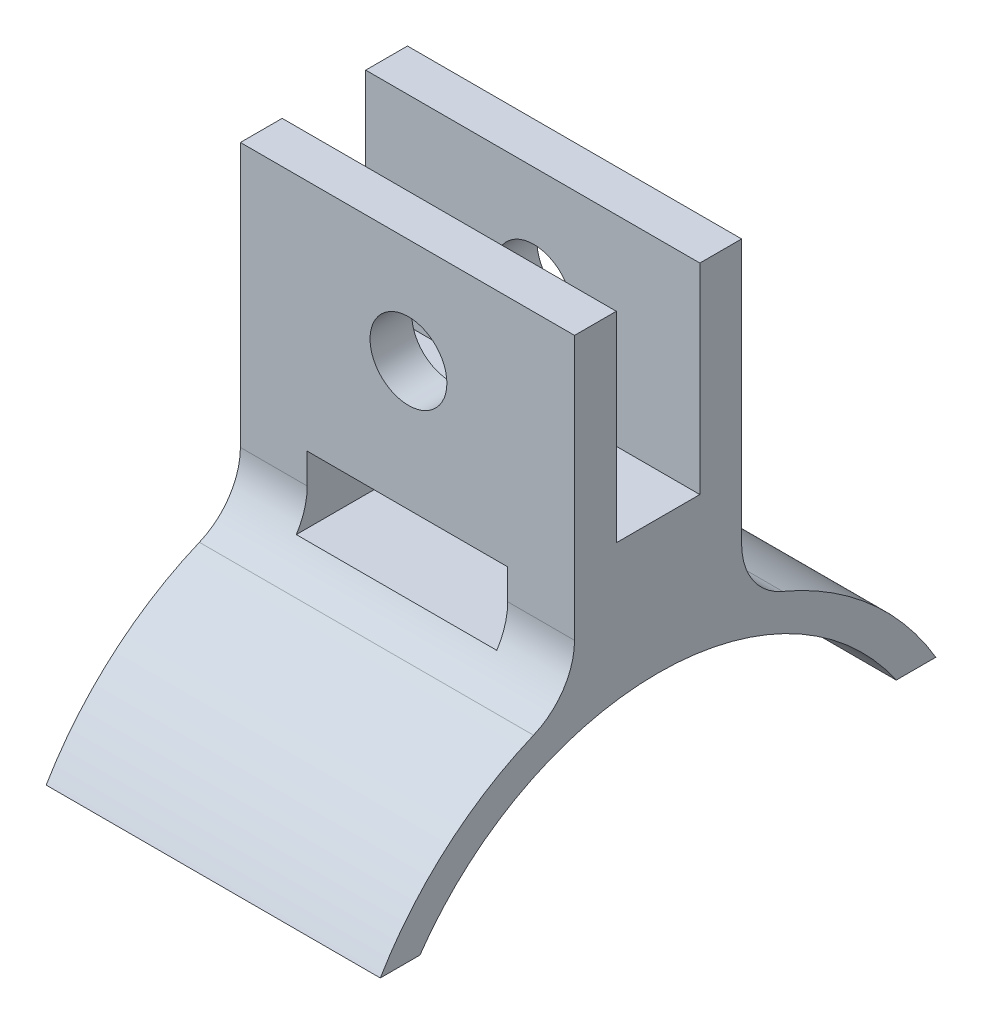
ISO-10303-21;
HEADER;
FILE_DESCRIPTION(('STEP AP214'),'2;1');
FILE_NAME('part.step','',(''),(''),'','','');
FILE_SCHEMA(('AUTOMOTIVE_DESIGN { 1 0 10303 214 1 1 1 1 }'));
ENDSEC;
DATA;
#1=APPLICATION_CONTEXT('core data for automotive mechanical design processes');
#2=APPLICATION_PROTOCOL_DEFINITION('international standard','automotive_design',2000,#1);
#3=PRODUCT_CONTEXT('',#1,'mechanical');
#4=PRODUCT('Part','Part','',(#3));
#5=PRODUCT_RELATED_PRODUCT_CATEGORY('part','',(#4));
#6=PRODUCT_DEFINITION_FORMATION('','',#4);
#7=PRODUCT_DEFINITION_CONTEXT('part definition',#1,'design');
#8=PRODUCT_DEFINITION('design','',#6,#7);
#9=PRODUCT_DEFINITION_SHAPE('','',#8);
#10=(LENGTH_UNIT() NAMED_UNIT(*) SI_UNIT(.MILLI.,.METRE.));
#11=(NAMED_UNIT(*) PLANE_ANGLE_UNIT() SI_UNIT($,.RADIAN.));
#12=(NAMED_UNIT(*) SI_UNIT($,.STERADIAN.) SOLID_ANGLE_UNIT());
#13=UNCERTAINTY_MEASURE_WITH_UNIT(LENGTH_MEASURE(1.E-05),#10,'distance_accuracy_value','');
#14=(GEOMETRIC_REPRESENTATION_CONTEXT(3) GLOBAL_UNCERTAINTY_ASSIGNED_CONTEXT((#13)) GLOBAL_UNIT_ASSIGNED_CONTEXT((#10,
#11,#12)) REPRESENTATION_CONTEXT('',''));
#15=CARTESIAN_POINT('',(0.,0.,0.));
#16=DIRECTION('',(0.,0.,1.));
#17=DIRECTION('',(1.,0.,0.));
#18=AXIS2_PLACEMENT_3D('',#15,#16,#17);
#19=CARTESIAN_POINT('',(0.,14.7955,13.517499908));
#20=DIRECTION('',(0.,-1.,0.));
#21=DIRECTION('',(0.,0.,-1.));
#22=AXIS2_PLACEMENT_3D('',#19,#20,#21);
#23=PLANE('',#22);
#24=DIRECTION('',(-1.,0.,0.));
#25=VECTOR('',#24,1.);
#26=CARTESIAN_POINT('',(6.35,14.7955,3.175));
#27=LINE('',#26,#25);
#28=CARTESIAN_POINT('',(20.9174333758312,14.7955,3.175));
#29=VERTEX_POINT('',#28);
#30=CARTESIAN_POINT('',(13.2974333758312,14.7955,3.175));
#31=VERTEX_POINT('',#30);
#32=EDGE_CURVE('E270',#29,#31,#27,.T.);
#33=ORIENTED_EDGE('',*,*,#32,.T.);
#34=DIRECTION('',(0.,0.,-1.));
#35=VECTOR('',#34,1.);
#36=CARTESIAN_POINT('',(13.2974333758312,14.7955,13.517499908));
#37=LINE('',#36,#35);
#38=CARTESIAN_POINT('',(13.2974333758312,14.7955,-3.175));
#39=VERTEX_POINT('',#38);
#40=EDGE_CURVE('E239',#31,#39,#37,.T.);
#41=ORIENTED_EDGE('',*,*,#40,.T.);
#42=DIRECTION('',(1.,0.,0.));
#43=VECTOR('',#42,1.);
#44=CARTESIAN_POINT('',(6.35,14.7955,-3.175));
#45=LINE('',#44,#43);
#46=CARTESIAN_POINT('',(20.9174333758312,14.7955,-3.175));
#47=VERTEX_POINT('',#46);
#48=EDGE_CURVE('E320',#39,#47,#45,.T.);
#49=ORIENTED_EDGE('',*,*,#48,.T.);
#50=DIRECTION('',(0.,0.,-1.));
#51=VECTOR('',#50,1.);
#52=CARTESIAN_POINT('',(20.9174333758312,14.7955,13.517499908));
#53=LINE('',#52,#51);
#54=EDGE_CURVE('E247',#29,#47,#53,.T.);
#55=ORIENTED_EDGE('',*,*,#54,.F.);
#56=EDGE_LOOP('',(#33,#41,#49,#55));
#57=FACE_BOUND('',#56,.T.);
#58=ADVANCED_FACE('F37',(#57),#23,.T.);
#59=CARTESIAN_POINT('',(13.2974333758312,0.,13.517499908));
#60=DIRECTION('',(1.,0.,0.));
#61=DIRECTION('',(0.,0.,-1.));
#62=AXIS2_PLACEMENT_3D('',#59,#60,#61);
#63=PLANE('',#62);
#64=DIRECTION('',(0.,1.,0.));
#65=VECTOR('',#64,1.);
#66=CARTESIAN_POINT('',(13.2974333758312,23.6855,-3.175));
#67=LINE('',#66,#65);
#68=CARTESIAN_POINT('',(13.2974333758312,13.6471826854483,-3.175));
#69=VERTEX_POINT('',#68);
#70=EDGE_CURVE('E268',#69,#39,#67,.T.);
#71=ORIENTED_EDGE('',*,*,#70,.T.);
#72=ORIENTED_EDGE('',*,*,#40,.F.);
#73=DIRECTION('',(0.,-1.,0.));
#74=VECTOR('',#73,1.);
#75=CARTESIAN_POINT('',(13.2974333758312,23.6855,3.175));
#76=LINE('',#75,#74);
#77=CARTESIAN_POINT('',(13.2974333758312,13.6471826854483,3.175));
#78=VERTEX_POINT('',#77);
#79=EDGE_CURVE('E263',#31,#78,#76,.T.);
#80=ORIENTED_EDGE('',*,*,#79,.T.);
#81=CARTESIAN_POINT('',(13.2974333758312,13.6471826854483,5.715));
#82=DIRECTION('',(1.,0.,0.));
#83=DIRECTION('',(0.,0.,-1.));
#84=AXIS2_PLACEMENT_3D('',#81,#82,#83);
#85=CIRCLE('',#84,2.54);
#86=CARTESIAN_POINT('',(13.2974333758312,12.2555,3.59018958421618));
#87=VERTEX_POINT('',#86);
#88=EDGE_CURVE('E318',#78,#87,#85,.F.);
#89=ORIENTED_EDGE('',*,*,#88,.T.);
#90=DIRECTION('',(0.,0.,-1.));
#91=VECTOR('',#90,1.);
#92=CARTESIAN_POINT('',(13.2974333758312,12.2555,13.517499908));
#93=LINE('',#92,#91);
#94=CARTESIAN_POINT('',(13.2974333758312,12.2555,-3.59018958421619));
#95=VERTEX_POINT('',#94);
#96=EDGE_CURVE('E240',#87,#95,#93,.T.);
#97=ORIENTED_EDGE('',*,*,#96,.T.);
#98=CARTESIAN_POINT('',(13.2974333758312,13.6471826854483,-5.71500000000001));
#99=DIRECTION('',(1.,0.,0.));
#100=DIRECTION('',(0.,0.,-1.));
#101=AXIS2_PLACEMENT_3D('',#98,#99,#100);
#102=CIRCLE('',#101,2.54);
#103=EDGE_CURVE('E266',#95,#69,#102,.F.);
#104=ORIENTED_EDGE('',*,*,#103,.T.);
#105=EDGE_LOOP('',(#71,#72,#80,#89,#97,#104));
#106=FACE_BOUND('',#105,.T.);
#107=ADVANCED_FACE('F397',(#106),#63,.T.);
#108=CARTESIAN_POINT('',(0.,12.2555,13.517499908));
#109=DIRECTION('',(0.,-1.,0.));
#110=DIRECTION('',(0.,0.,-1.));
#111=AXIS2_PLACEMENT_3D('',#108,#109,#110);
#112=PLANE('',#111);
#113=ORIENTED_EDGE('',*,*,#96,.F.);
#114=DIRECTION('',(-1.,0.,0.));
#115=VECTOR('',#114,1.);
#116=CARTESIAN_POINT('',(27.94,12.2555,3.59018958421618));
#117=LINE('',#116,#115);
#118=CARTESIAN_POINT('',(20.9174333758312,12.2555,3.59018958421618));
#119=VERTEX_POINT('',#118);
#120=EDGE_CURVE('E315',#119,#87,#117,.T.);
#121=ORIENTED_EDGE('',*,*,#120,.F.);
#122=DIRECTION('',(0.,0.,-1.));
#123=VECTOR('',#122,1.);
#124=CARTESIAN_POINT('',(20.9174333758312,12.2555,13.517499908));
#125=LINE('',#124,#123);
#126=CARTESIAN_POINT('',(20.9174333758312,12.2555,-3.59018958421619));
#127=VERTEX_POINT('',#126);
#128=EDGE_CURVE('E244',#119,#127,#125,.T.);
#129=ORIENTED_EDGE('',*,*,#128,.T.);
#130=DIRECTION('',(-1.,0.,0.));
#131=VECTOR('',#130,1.);
#132=CARTESIAN_POINT('',(27.94,12.2555,-3.59018958421619));
#133=LINE('',#132,#131);
#134=EDGE_CURVE('E260',#95,#127,#133,.F.);
#135=ORIENTED_EDGE('',*,*,#134,.F.);
#136=EDGE_LOOP('',(#113,#121,#129,#135));
#137=FACE_BOUND('',#136,.T.);
#138=ADVANCED_FACE('F403',(#137),#112,.F.);
#139=CARTESIAN_POINT('',(20.9174333758312,0.,13.517499908));
#140=DIRECTION('',(1.,0.,0.));
#141=DIRECTION('',(0.,0.,-1.));
#142=AXIS2_PLACEMENT_3D('',#139,#140,#141);
#143=PLANE('',#142);
#144=CARTESIAN_POINT('',(20.9174333758312,13.6471826854483,-5.71500000000001));
#145=DIRECTION('',(1.,0.,0.));
#146=DIRECTION('',(0.,0.,-1.));
#147=AXIS2_PLACEMENT_3D('',#144,#145,#146);
#148=CIRCLE('',#147,2.54);
#149=CARTESIAN_POINT('',(20.9174333758312,13.6471826854483,-3.175));
#150=VERTEX_POINT('',#149);
#151=EDGE_CURVE('E254',#127,#150,#148,.F.);
#152=ORIENTED_EDGE('',*,*,#151,.F.);
#153=ORIENTED_EDGE('',*,*,#128,.F.);
#154=CARTESIAN_POINT('',(20.9174333758312,13.6471826854483,5.715));
#155=DIRECTION('',(1.,0.,0.));
#156=DIRECTION('',(0.,0.,-1.));
#157=AXIS2_PLACEMENT_3D('',#154,#155,#156);
#158=CIRCLE('',#157,2.54);
#159=CARTESIAN_POINT('',(20.9174333758312,13.6471826854483,3.175));
#160=VERTEX_POINT('',#159);
#161=EDGE_CURVE('E312',#160,#119,#158,.F.);
#162=ORIENTED_EDGE('',*,*,#161,.F.);
#163=DIRECTION('',(0.,-1.,0.));
#164=VECTOR('',#163,1.);
#165=CARTESIAN_POINT('',(20.9174333758312,23.6855,3.175));
#166=LINE('',#165,#164);
#167=EDGE_CURVE('E243',#29,#160,#166,.T.);
#168=ORIENTED_EDGE('',*,*,#167,.F.);
#169=ORIENTED_EDGE('',*,*,#54,.T.);
#170=DIRECTION('',(0.,1.,0.));
#171=VECTOR('',#170,1.);
#172=CARTESIAN_POINT('',(20.9174333758312,23.6855,-3.175));
#173=LINE('',#172,#171);
#174=EDGE_CURVE('E257',#150,#47,#173,.T.);
#175=ORIENTED_EDGE('',*,*,#174,.F.);
#176=EDGE_LOOP('',(#152,#153,#162,#168,#169,#175));
#177=FACE_BOUND('',#176,.T.);
#178=ADVANCED_FACE('F407',(#177),#143,.F.);
#179=CARTESIAN_POINT('',(17.145,19.685,-12.2555));
#180=DIRECTION('',(0.,0.,1.));
#181=DIRECTION('',(1.,0.,0.));
#182=AXIS2_PLACEMENT_3D('',#179,#180,#181);
#183=CYLINDRICAL_SURFACE('',#182,1.4605);
#184=CARTESIAN_POINT('',(17.145,19.685,-1.5875));
#185=DIRECTION('',(0.,0.,-1.));
#186=DIRECTION('',(-1.,0.,0.));
#187=AXIS2_PLACEMENT_3D('',#184,#185,#186);
#188=CIRCLE('',#187,1.4605);
#189=CARTESIAN_POINT('',(15.6845,19.685,-1.5875));
#190=VERTEX_POINT('',#189);
#191=EDGE_CURVE('E289',#190,#190,#188,.F.);
#192=ORIENTED_EDGE('',*,*,#191,.T.);
#193=EDGE_LOOP('',(#192));
#194=FACE_BOUND('',#193,.T.);
#195=CARTESIAN_POINT('',(17.145,19.685,-3.175));
#196=DIRECTION('',(0.,0.,1.));
#197=DIRECTION('',(1.,0.,0.));
#198=AXIS2_PLACEMENT_3D('',#195,#196,#197);
#199=CIRCLE('',#198,1.4605);
#200=CARTESIAN_POINT('',(18.6055,19.685,-3.175));
#201=VERTEX_POINT('',#200);
#202=EDGE_CURVE('E288',#201,#201,#199,.T.);
#203=ORIENTED_EDGE('',*,*,#202,.F.);
#204=EDGE_LOOP('',(#203));
#205=FACE_BOUND('',#204,.T.);
#206=ADVANCED_FACE('F419',(#194,#205),#183,.F.);
#207=CARTESIAN_POINT('',(17.145,19.685,1.5875));
#208=DIRECTION('',(0.,0.,1.));
#209=DIRECTION('',(1.,0.,0.));
#210=AXIS2_PLACEMENT_3D('',#207,#208,#209);
#211=CIRCLE('',#210,1.4605);
#212=CARTESIAN_POINT('',(18.6055,19.685,1.5875));
#213=VERTEX_POINT('',#212);
#214=EDGE_CURVE('E276',#213,#213,#211,.F.);
#215=ORIENTED_EDGE('',*,*,#214,.T.);
#216=EDGE_LOOP('',(#215));
#217=FACE_BOUND('',#216,.T.);
#218=CARTESIAN_POINT('',(17.145,19.685,3.175));
#219=DIRECTION('',(0.,0.,1.));
#220=DIRECTION('',(1.,0.,0.));
#221=AXIS2_PLACEMENT_3D('',#218,#219,#220);
#222=CIRCLE('',#221,1.4605);
#223=CARTESIAN_POINT('',(18.6055,19.685,3.175));
#224=VERTEX_POINT('',#223);
#225=EDGE_CURVE('E285',#224,#224,#222,.T.);
#226=ORIENTED_EDGE('',*,*,#225,.T.);
#227=EDGE_LOOP('',(#226));
#228=FACE_BOUND('',#227,.T.);
#229=ADVANCED_FACE('F417',(#217,#228),#183,.F.);
#230=CARTESIAN_POINT('',(27.94,0.,0.));
#231=DIRECTION('',(-1.,0.,0.));
#232=DIRECTION('',(0.,0.,1.));
#233=AXIS2_PLACEMENT_3D('',#230,#231,#232);
#234=CYLINDRICAL_SURFACE('',#233,12.2555);
#235=CARTESIAN_POINT('',(10.7574333758312,0.,0.));
#236=DIRECTION('',(-1.,0.,0.));
#237=DIRECTION('',(0.,-1.,0.));
#238=AXIS2_PLACEMENT_3D('',#235,#236,#237);
#239=CIRCLE('',#238,12.2555);
#240=CARTESIAN_POINT('',(10.7574333758312,11.3043187051138,-4.73388412017168));
#241=VERTEX_POINT('',#240);
#242=CARTESIAN_POINT('',(10.7574333758312,6.22431870511383,-10.5572314982277));
#243=VERTEX_POINT('',#242);
#244=EDGE_CURVE('E217',#241,#243,#239,.T.);
#245=ORIENTED_EDGE('',*,*,#244,.F.);
#246=DIRECTION('',(-1.,0.,0.));
#247=VECTOR('',#246,1.);
#248=CARTESIAN_POINT('',(27.94,11.3043187051138,-4.73388412017168));
#249=LINE('',#248,#247);
#250=CARTESIAN_POINT('',(23.4574333758312,11.3043187051138,-4.73388412017168));
#251=VERTEX_POINT('',#250);
#252=EDGE_CURVE('E192',#241,#251,#249,.F.);
#253=ORIENTED_EDGE('',*,*,#252,.T.);
#254=CARTESIAN_POINT('',(23.4574333758312,0.,0.));
#255=DIRECTION('',(-1.,0.,0.));
#256=DIRECTION('',(0.,-1.,0.));
#257=AXIS2_PLACEMENT_3D('',#254,#255,#256);
#258=CIRCLE('',#257,12.2555);
#259=CARTESIAN_POINT('',(23.4574333758312,6.22431870511383,-10.5572314982277));
#260=VERTEX_POINT('',#259);
#261=EDGE_CURVE('E183',#251,#260,#258,.T.);
#262=ORIENTED_EDGE('',*,*,#261,.T.);
#263=DIRECTION('',(-1.,0.,0.));
#264=VECTOR('',#263,1.);
#265=CARTESIAN_POINT('',(27.94,6.22431870511383,-10.5572314982277));
#266=LINE('',#265,#264);
#267=EDGE_CURVE('E11',#243,#260,#266,.F.);
#268=ORIENTED_EDGE('',*,*,#267,.F.);
#269=EDGE_LOOP('',(#245,#253,#262,#268));
#270=FACE_BOUND('',#269,.T.);
#271=ADVANCED_FACE('F190',(#270),#234,.T.);
#272=CARTESIAN_POINT('',(27.94,13.6471826854483,-5.71500000000001));
#273=DIRECTION('',(-1.,0.,0.));
#274=DIRECTION('',(0.,0.,1.));
#275=AXIS2_PLACEMENT_3D('',#272,#273,#274);
#276=CYLINDRICAL_SURFACE('',#275,2.54);
#277=CARTESIAN_POINT('',(10.7574333758312,13.6471826854483,-5.71500000000001));
#278=DIRECTION('',(-1.,0.,0.));
#279=DIRECTION('',(0.,-1.,0.));
#280=AXIS2_PLACEMENT_3D('',#277,#278,#279);
#281=CIRCLE('',#280,2.54);
#282=CARTESIAN_POINT('',(10.7574333758312,13.6471826854483,-3.175));
#283=VERTEX_POINT('',#282);
#284=EDGE_CURVE('E219',#283,#241,#281,.F.);
#285=ORIENTED_EDGE('',*,*,#284,.F.);
#286=DIRECTION('',(1.,0.,0.));
#287=VECTOR('',#286,1.);
#288=CARTESIAN_POINT('',(6.35,13.6471826854483,-3.175));
#289=LINE('',#288,#287);
#290=EDGE_CURVE('E296',#69,#283,#289,.F.);
#291=ORIENTED_EDGE('',*,*,#290,.F.);
#292=ORIENTED_EDGE('',*,*,#103,.F.);
#293=ORIENTED_EDGE('',*,*,#134,.T.);
#294=ORIENTED_EDGE('',*,*,#151,.T.);
#295=CARTESIAN_POINT('',(23.4574333758312,13.6471826854483,-3.175));
#296=VERTEX_POINT('',#295);
#297=EDGE_CURVE('E303',#296,#150,#289,.F.);
#298=ORIENTED_EDGE('',*,*,#297,.F.);
#299=CARTESIAN_POINT('',(23.4574333758312,13.6471826854483,-5.71500000000001));
#300=DIRECTION('',(-1.,0.,0.));
#301=DIRECTION('',(0.,-1.,0.));
#302=AXIS2_PLACEMENT_3D('',#299,#300,#301);
#303=CIRCLE('',#302,2.54);
#304=EDGE_CURVE('E193',#296,#251,#303,.F.);
#305=ORIENTED_EDGE('',*,*,#304,.T.);
#306=ORIENTED_EDGE('',*,*,#252,.F.);
#307=EDGE_LOOP('',(#285,#291,#292,#293,#294,#298,#305,#306));
#308=FACE_BOUND('',#307,.T.);
#309=ADVANCED_FACE('F375',(#308),#276,.F.);
#310=CARTESIAN_POINT('',(27.94,16.0655,-1.5875));
#311=DIRECTION('',(0.,-1.,0.));
#312=DIRECTION('',(0.,0.,-1.));
#313=AXIS2_PLACEMENT_3D('',#310,#311,#312);
#314=PLANE('',#313);
#315=DIRECTION('',(0.,0.,-1.));
#316=VECTOR('',#315,1.);
#317=CARTESIAN_POINT('',(10.7574333758312,16.0655,-1.5875));
#318=LINE('',#317,#316);
#319=CARTESIAN_POINT('',(10.7574333758312,16.0655,1.5875));
#320=VERTEX_POINT('',#319);
#321=CARTESIAN_POINT('',(10.7574333758312,16.0655,-1.5875));
#322=VERTEX_POINT('',#321);
#323=EDGE_CURVE('E45',#320,#322,#318,.T.);
#324=ORIENTED_EDGE('',*,*,#323,.F.);
#325=DIRECTION('',(-1.,0.,0.));
#326=VECTOR('',#325,1.);
#327=CARTESIAN_POINT('',(27.94,16.0655,1.5875));
#328=LINE('',#327,#326);
#329=CARTESIAN_POINT('',(23.4574333758312,16.0655,1.5875));
#330=VERTEX_POINT('',#329);
#331=EDGE_CURVE('E280',#330,#320,#328,.T.);
#332=ORIENTED_EDGE('',*,*,#331,.F.);
#333=DIRECTION('',(0.,0.,-1.));
#334=VECTOR('',#333,1.);
#335=CARTESIAN_POINT('',(23.4574333758312,16.0655,-1.5875));
#336=LINE('',#335,#334);
#337=CARTESIAN_POINT('',(23.4574333758312,16.0655,-1.5875));
#338=VERTEX_POINT('',#337);
#339=EDGE_CURVE('E322',#330,#338,#336,.T.);
#340=ORIENTED_EDGE('',*,*,#339,.T.);
#341=DIRECTION('',(-1.,0.,0.));
#342=VECTOR('',#341,1.);
#343=CARTESIAN_POINT('',(27.94,16.0655,-1.5875));
#344=LINE('',#343,#342);
#345=EDGE_CURVE('E272',#338,#322,#344,.T.);
#346=ORIENTED_EDGE('',*,*,#345,.T.);
#347=EDGE_LOOP('',(#324,#332,#340,#346));
#348=FACE_BOUND('',#347,.T.);
#349=ADVANCED_FACE('F336',(#348),#314,.F.);
#350=CARTESIAN_POINT('',(27.94,23.6855,1.5875));
#351=DIRECTION('',(0.,0.,1.));
#352=DIRECTION('',(1.,0.,0.));
#353=AXIS2_PLACEMENT_3D('',#350,#351,#352);
#354=PLANE('',#353);
#355=ORIENTED_EDGE('',*,*,#214,.F.);
#356=EDGE_LOOP('',(#355));
#357=FACE_BOUND('',#356,.T.);
#358=DIRECTION('',(0.,-1.,0.));
#359=VECTOR('',#358,1.);
#360=CARTESIAN_POINT('',(10.7574333758312,23.6855,1.5875));
#361=LINE('',#360,#359);
#362=CARTESIAN_POINT('',(10.7574333758312,23.6855,1.5875));
#363=VERTEX_POINT('',#362);
#364=EDGE_CURVE('E213',#363,#320,#361,.T.);
#365=ORIENTED_EDGE('',*,*,#364,.F.);
#366=DIRECTION('',(-1.,0.,0.));
#367=VECTOR('',#366,1.);
#368=CARTESIAN_POINT('',(27.94,23.6855,1.5875));
#369=LINE('',#368,#367);
#370=CARTESIAN_POINT('',(23.4574333758312,23.6855,1.5875));
#371=VERTEX_POINT('',#370);
#372=EDGE_CURVE('E277',#371,#363,#369,.T.);
#373=ORIENTED_EDGE('',*,*,#372,.F.);
#374=DIRECTION('',(0.,-1.,0.));
#375=VECTOR('',#374,1.);
#376=CARTESIAN_POINT('',(23.4574333758312,23.6855,1.5875));
#377=LINE('',#376,#375);
#378=EDGE_CURVE('E197',#371,#330,#377,.T.);
#379=ORIENTED_EDGE('',*,*,#378,.T.);
#380=ORIENTED_EDGE('',*,*,#331,.T.);
#381=EDGE_LOOP('',(#365,#373,#379,#380));
#382=FACE_BOUND('',#381,.T.);
#383=ADVANCED_FACE('F341',(#357,#382),#354,.F.);
#384=CARTESIAN_POINT('',(27.94,23.6855,-1.5875));
#385=DIRECTION('',(0.,0.,-1.));
#386=DIRECTION('',(-1.,0.,0.));
#387=AXIS2_PLACEMENT_3D('',#384,#385,#386);
#388=PLANE('',#387);
#389=ORIENTED_EDGE('',*,*,#191,.F.);
#390=EDGE_LOOP('',(#389));
#391=FACE_BOUND('',#390,.T.);
#392=DIRECTION('',(0.,1.,0.));
#393=VECTOR('',#392,1.);
#394=CARTESIAN_POINT('',(10.7574333758312,23.6855,-1.5875));
#395=LINE('',#394,#393);
#396=CARTESIAN_POINT('',(10.7574333758312,23.6855,-1.5875));
#397=VERTEX_POINT('',#396);
#398=EDGE_CURVE('E215',#322,#397,#395,.T.);
#399=ORIENTED_EDGE('',*,*,#398,.F.);
#400=ORIENTED_EDGE('',*,*,#345,.F.);
#401=DIRECTION('',(0.,1.,0.));
#402=VECTOR('',#401,1.);
#403=CARTESIAN_POINT('',(23.4574333758312,23.6855,-1.5875));
#404=LINE('',#403,#402);
#405=CARTESIAN_POINT('',(23.4574333758312,23.6855,-1.5875));
#406=VERTEX_POINT('',#405);
#407=EDGE_CURVE('E59',#338,#406,#404,.T.);
#408=ORIENTED_EDGE('',*,*,#407,.T.);
#409=DIRECTION('',(-1.,0.,0.));
#410=VECTOR('',#409,1.);
#411=CARTESIAN_POINT('',(27.94,23.6855,-1.5875));
#412=LINE('',#411,#410);
#413=EDGE_CURVE('E273',#406,#397,#412,.T.);
#414=ORIENTED_EDGE('',*,*,#413,.T.);
#415=EDGE_LOOP('',(#399,#400,#408,#414));
#416=FACE_BOUND('',#415,.T.);
#417=ADVANCED_FACE('F334',(#391,#416),#388,.F.);
#418=CARTESIAN_POINT('',(0.,23.6855,0.));
#419=DIRECTION('',(0.,1.,0.));
#420=DIRECTION('',(0.,0.,1.));
#421=AXIS2_PLACEMENT_3D('',#418,#419,#420);
#422=PLANE('',#421);
#423=ORIENTED_EDGE('',*,*,#372,.T.);
#424=DIRECTION('',(0.,0.,1.));
#425=VECTOR('',#424,1.);
#426=CARTESIAN_POINT('',(10.7574333758312,23.6855,-13.517499908));
#427=LINE('',#426,#425);
#428=CARTESIAN_POINT('',(10.7574333758312,23.6855,3.175));
#429=VERTEX_POINT('',#428);
#430=EDGE_CURVE('E344',#363,#429,#427,.T.);
#431=ORIENTED_EDGE('',*,*,#430,.T.);
#432=DIRECTION('',(1.,0.,0.));
#433=VECTOR('',#432,1.);
#434=CARTESIAN_POINT('',(6.35,23.6855,3.175));
#435=LINE('',#434,#433);
#436=CARTESIAN_POINT('',(23.4574333758312,23.6855,3.175));
#437=VERTEX_POINT('',#436);
#438=EDGE_CURVE('E290',#429,#437,#435,.T.);
#439=ORIENTED_EDGE('',*,*,#438,.T.);
#440=DIRECTION('',(0.,0.,1.));
#441=VECTOR('',#440,1.);
#442=CARTESIAN_POINT('',(23.4574333758312,23.6855,-13.517499908));
#443=LINE('',#442,#441);
#444=EDGE_CURVE('E348',#371,#437,#443,.T.);
#445=ORIENTED_EDGE('',*,*,#444,.F.);
#446=EDGE_LOOP('',(#423,#431,#439,#445));
#447=FACE_BOUND('',#446,.T.);
#448=ADVANCED_FACE('F369',(#447),#422,.T.);
#449=DIRECTION('',(-1.,0.,0.));
#450=VECTOR('',#449,1.);
#451=CARTESIAN_POINT('',(6.35,23.6855,-3.175));
#452=LINE('',#451,#450);
#453=CARTESIAN_POINT('',(23.4574333758312,23.6855,-3.175));
#454=VERTEX_POINT('',#453);
#455=CARTESIAN_POINT('',(10.7574333758312,23.6855,-3.175));
#456=VERTEX_POINT('',#455);
#457=EDGE_CURVE('E293',#454,#456,#452,.T.);
#458=ORIENTED_EDGE('',*,*,#457,.T.);
#459=EDGE_CURVE('E347',#456,#397,#427,.T.);
#460=ORIENTED_EDGE('',*,*,#459,.T.);
#461=ORIENTED_EDGE('',*,*,#413,.F.);
#462=EDGE_CURVE('E349',#454,#406,#443,.T.);
#463=ORIENTED_EDGE('',*,*,#462,.F.);
#464=EDGE_LOOP('',(#458,#460,#461,#463));
#465=FACE_BOUND('',#464,.T.);
#466=ADVANCED_FACE('F386',(#465),#422,.T.);
#467=CARTESIAN_POINT('',(6.35,23.6855,-3.175));
#468=DIRECTION('',(0.,0.,1.));
#469=DIRECTION('',(1.,0.,0.));
#470=AXIS2_PLACEMENT_3D('',#467,#468,#469);
#471=PLANE('',#470);
#472=ORIENTED_EDGE('',*,*,#202,.T.);
#473=EDGE_LOOP('',(#472));
#474=FACE_BOUND('',#473,.T.);
#475=DIRECTION('',(0.,-1.,0.));
#476=VECTOR('',#475,1.);
#477=CARTESIAN_POINT('',(10.7574333758312,23.6855,-3.175));
#478=LINE('',#477,#476);
#479=EDGE_CURVE('E221',#456,#283,#478,.T.);
#480=ORIENTED_EDGE('',*,*,#479,.F.);
#481=ORIENTED_EDGE('',*,*,#457,.F.);
#482=DIRECTION('',(0.,-1.,0.));
#483=VECTOR('',#482,1.);
#484=CARTESIAN_POINT('',(23.4574333758312,23.6855,-3.175));
#485=LINE('',#484,#483);
#486=EDGE_CURVE('E195',#454,#296,#485,.T.);
#487=ORIENTED_EDGE('',*,*,#486,.T.);
#488=ORIENTED_EDGE('',*,*,#297,.T.);
#489=ORIENTED_EDGE('',*,*,#174,.T.);
#490=ORIENTED_EDGE('',*,*,#48,.F.);
#491=ORIENTED_EDGE('',*,*,#70,.F.);
#492=ORIENTED_EDGE('',*,*,#290,.T.);
#493=EDGE_LOOP('',(#480,#481,#487,#488,#489,#490,#491,#492));
#494=FACE_BOUND('',#493,.T.);
#495=ADVANCED_FACE('F383',(#474,#494),#471,.F.);
#496=CARTESIAN_POINT('',(10.7574333758312,0.,0.));
#497=DIRECTION('',(-1.,0.,0.));
#498=DIRECTION('',(0.,-1.,0.));
#499=AXIS2_PLACEMENT_3D('',#496,#497,#498);
#500=CIRCLE('',#499,12.2555);
#501=CARTESIAN_POINT('',(10.7574333758312,6.22431870511383,10.5572314982277));
#502=VERTEX_POINT('',#501);
#503=CARTESIAN_POINT('',(10.7574333758312,11.3043187051138,4.73388412017167));
#504=VERTEX_POINT('',#503);
#505=EDGE_CURVE('E223',#502,#504,#500,.T.);
#506=ORIENTED_EDGE('',*,*,#505,.F.);
#507=DIRECTION('',(-1.,0.,0.));
#508=VECTOR('',#507,1.);
#509=CARTESIAN_POINT('',(27.94,6.22431870511383,10.5572314982277));
#510=LINE('',#509,#508);
#511=CARTESIAN_POINT('',(23.4574333758312,6.22431870511383,10.5572314982277));
#512=VERTEX_POINT('',#511);
#513=EDGE_CURVE('E232',#512,#502,#510,.T.);
#514=ORIENTED_EDGE('',*,*,#513,.F.);
#515=CARTESIAN_POINT('',(23.4574333758312,0.,0.));
#516=DIRECTION('',(-1.,0.,0.));
#517=DIRECTION('',(0.,-1.,0.));
#518=AXIS2_PLACEMENT_3D('',#515,#516,#517);
#519=CIRCLE('',#518,12.2555);
#520=CARTESIAN_POINT('',(23.4574333758312,11.3043187051138,4.73388412017167));
#521=VERTEX_POINT('',#520);
#522=EDGE_CURVE('E203',#512,#521,#519,.T.);
#523=ORIENTED_EDGE('',*,*,#522,.T.);
#524=DIRECTION('',(-1.,0.,0.));
#525=VECTOR('',#524,1.);
#526=CARTESIAN_POINT('',(27.94,11.3043187051138,4.73388412017167));
#527=LINE('',#526,#525);
#528=EDGE_CURVE('E309',#521,#504,#527,.T.);
#529=ORIENTED_EDGE('',*,*,#528,.T.);
#530=EDGE_LOOP('',(#506,#514,#523,#529));
#531=FACE_BOUND('',#530,.T.);
#532=ADVANCED_FACE('F356',(#531),#234,.T.);
#533=CARTESIAN_POINT('',(27.94,13.6471826854483,5.715));
#534=DIRECTION('',(-1.,0.,0.));
#535=DIRECTION('',(0.,0.,1.));
#536=AXIS2_PLACEMENT_3D('',#533,#534,#535);
#537=CYLINDRICAL_SURFACE('',#536,2.54);
#538=CARTESIAN_POINT('',(10.7574333758312,13.6471826854483,5.715));
#539=DIRECTION('',(-1.,0.,0.));
#540=DIRECTION('',(0.,-1.,0.));
#541=AXIS2_PLACEMENT_3D('',#538,#539,#540);
#542=CIRCLE('',#541,2.54);
#543=CARTESIAN_POINT('',(10.7574333758312,13.6471826854483,3.175));
#544=VERTEX_POINT('',#543);
#545=EDGE_CURVE('E225',#504,#544,#542,.F.);
#546=ORIENTED_EDGE('',*,*,#545,.F.);
#547=ORIENTED_EDGE('',*,*,#528,.F.);
#548=CARTESIAN_POINT('',(23.4574333758312,13.6471826854483,5.715));
#549=DIRECTION('',(-1.,0.,0.));
#550=DIRECTION('',(0.,-1.,0.));
#551=AXIS2_PLACEMENT_3D('',#548,#549,#550);
#552=CIRCLE('',#551,2.54);
#553=CARTESIAN_POINT('',(23.4574333758312,13.6471826854483,3.175));
#554=VERTEX_POINT('',#553);
#555=EDGE_CURVE('E206',#521,#554,#552,.F.);
#556=ORIENTED_EDGE('',*,*,#555,.T.);
#557=DIRECTION('',(1.,0.,0.));
#558=VECTOR('',#557,1.);
#559=CARTESIAN_POINT('',(27.94,13.6471826854483,3.175));
#560=LINE('',#559,#558);
#561=EDGE_CURVE('E306',#160,#554,#560,.T.);
#562=ORIENTED_EDGE('',*,*,#561,.F.);
#563=ORIENTED_EDGE('',*,*,#161,.T.);
#564=ORIENTED_EDGE('',*,*,#120,.T.);
#565=ORIENTED_EDGE('',*,*,#88,.F.);
#566=EDGE_CURVE('E307',#544,#78,#560,.T.);
#567=ORIENTED_EDGE('',*,*,#566,.F.);
#568=EDGE_LOOP('',(#546,#547,#556,#562,#563,#564,#565,#567));
#569=FACE_BOUND('',#568,.T.);
#570=ADVANCED_FACE('F39',(#569),#537,.F.);
#571=CARTESIAN_POINT('',(6.35,23.6855,3.175));
#572=DIRECTION('',(0.,0.,-1.));
#573=DIRECTION('',(-1.,0.,0.));
#574=AXIS2_PLACEMENT_3D('',#571,#572,#573);
#575=PLANE('',#574);
#576=ORIENTED_EDGE('',*,*,#225,.F.);
#577=EDGE_LOOP('',(#576));
#578=FACE_BOUND('',#577,.T.);
#579=DIRECTION('',(0.,1.,0.));
#580=VECTOR('',#579,1.);
#581=CARTESIAN_POINT('',(10.7574333758312,23.6855,3.175));
#582=LINE('',#581,#580);
#583=EDGE_CURVE('E227',#544,#429,#582,.T.);
#584=ORIENTED_EDGE('',*,*,#583,.F.);
#585=ORIENTED_EDGE('',*,*,#566,.T.);
#586=ORIENTED_EDGE('',*,*,#79,.F.);
#587=ORIENTED_EDGE('',*,*,#32,.F.);
#588=ORIENTED_EDGE('',*,*,#167,.T.);
#589=ORIENTED_EDGE('',*,*,#561,.T.);
#590=DIRECTION('',(0.,1.,0.));
#591=VECTOR('',#590,1.);
#592=CARTESIAN_POINT('',(23.4574333758312,23.6855,3.175));
#593=LINE('',#592,#591);
#594=EDGE_CURVE('E209',#554,#437,#593,.T.);
#595=ORIENTED_EDGE('',*,*,#594,.T.);
#596=ORIENTED_EDGE('',*,*,#438,.F.);
#597=EDGE_LOOP('',(#584,#585,#586,#587,#588,#589,#595,#596));
#598=FACE_BOUND('',#597,.T.);
#599=ADVANCED_FACE('F366',(#578,#598),#575,.F.);
#600=CARTESIAN_POINT('',(0.,6.22431870511383,-13.517499908));
#601=DIRECTION('',(0.,-1.,0.));
#602=DIRECTION('',(0.,0.,-1.));
#603=AXIS2_PLACEMENT_3D('',#600,#601,#602);
#604=PLANE('',#603);
#605=DIRECTION('',(0.,0.,1.));
#606=VECTOR('',#605,1.);
#607=CARTESIAN_POINT('',(23.4574333758312,6.22431870511383,-13.517499908));
#608=LINE('',#607,#606);
#609=CARTESIAN_POINT('',(23.4574333758312,6.22431870511383,9.05202004566771));
#610=VERTEX_POINT('',#609);
#611=EDGE_CURVE('E52',#610,#512,#608,.T.);
#612=ORIENTED_EDGE('',*,*,#611,.T.);
#613=ORIENTED_EDGE('',*,*,#513,.T.);
#614=DIRECTION('',(0.,0.,1.));
#615=VECTOR('',#614,1.);
#616=CARTESIAN_POINT('',(10.7574333758312,6.22431870511383,-13.517499908));
#617=LINE('',#616,#615);
#618=CARTESIAN_POINT('',(10.7574333758312,6.22431870511383,9.05202004566771));
#619=VERTEX_POINT('',#618);
#620=EDGE_CURVE('E187',#619,#502,#617,.T.);
#621=ORIENTED_EDGE('',*,*,#620,.F.);
#622=DIRECTION('',(-1.,0.,0.));
#623=VECTOR('',#622,1.);
#624=CARTESIAN_POINT('',(27.94,6.22431870511383,9.05202004566771));
#625=LINE('',#624,#623);
#626=EDGE_CURVE('E236',#610,#619,#625,.T.);
#627=ORIENTED_EDGE('',*,*,#626,.F.);
#628=EDGE_LOOP('',(#612,#613,#621,#627));
#629=FACE_BOUND('',#628,.T.);
#630=ADVANCED_FACE('F370',(#629),#604,.T.);
#631=CARTESIAN_POINT('',(10.7574333758312,6.22431870511383,-9.05202004566771));
#632=VERTEX_POINT('',#631);
#633=EDGE_CURVE('E178',#243,#632,#617,.T.);
#634=ORIENTED_EDGE('',*,*,#633,.F.);
#635=ORIENTED_EDGE('',*,*,#267,.T.);
#636=CARTESIAN_POINT('',(23.4574333758312,6.22431870511383,-9.05202004566771));
#637=VERTEX_POINT('',#636);
#638=EDGE_CURVE('E175',#260,#637,#608,.T.);
#639=ORIENTED_EDGE('',*,*,#638,.T.);
#640=DIRECTION('',(-1.,0.,0.));
#641=VECTOR('',#640,1.);
#642=CARTESIAN_POINT('',(27.94,6.22431870511383,-9.05202004566771));
#643=LINE('',#642,#641);
#644=EDGE_CURVE('E234',#632,#637,#643,.F.);
#645=ORIENTED_EDGE('',*,*,#644,.F.);
#646=EDGE_LOOP('',(#634,#635,#639,#645));
#647=FACE_BOUND('',#646,.T.);
#648=ADVANCED_FACE('F174',(#647),#604,.T.);
#649=CARTESIAN_POINT('',(10.7574333758312,0.,-13.517499908));
#650=DIRECTION('',(-1.,0.,0.));
#651=DIRECTION('',(0.,-1.,0.));
#652=AXIS2_PLACEMENT_3D('',#649,#650,#651);
#653=PLANE('',#652);
#654=ORIENTED_EDGE('',*,*,#620,.T.);
#655=ORIENTED_EDGE('',*,*,#505,.T.);
#656=ORIENTED_EDGE('',*,*,#545,.T.);
#657=ORIENTED_EDGE('',*,*,#583,.T.);
#658=ORIENTED_EDGE('',*,*,#430,.F.);
#659=ORIENTED_EDGE('',*,*,#364,.T.);
#660=ORIENTED_EDGE('',*,*,#323,.T.);
#661=ORIENTED_EDGE('',*,*,#398,.T.);
#662=ORIENTED_EDGE('',*,*,#459,.F.);
#663=ORIENTED_EDGE('',*,*,#479,.T.);
#664=ORIENTED_EDGE('',*,*,#284,.T.);
#665=ORIENTED_EDGE('',*,*,#244,.T.);
#666=ORIENTED_EDGE('',*,*,#633,.T.);
#667=CARTESIAN_POINT('',(10.7574333758312,0.,0.));
#668=DIRECTION('',(-1.,0.,0.));
#669=DIRECTION('',(0.,-1.,0.));
#670=AXIS2_PLACEMENT_3D('',#667,#668,#669);
#671=CIRCLE('',#670,10.9855);
#672=EDGE_CURVE('E229',#619,#632,#671,.T.);
#673=ORIENTED_EDGE('',*,*,#672,.F.);
#674=EDGE_LOOP('',(#654,#655,#656,#657,#658,#659,#660,#661,#662,#663,#664,#665,#666,#673));
#675=FACE_BOUND('',#674,.T.);
#676=ADVANCED_FACE('F327',(#675),#653,.T.);
#677=CARTESIAN_POINT('',(23.4574333758312,0.,-13.517499908));
#678=DIRECTION('',(-1.,0.,0.));
#679=DIRECTION('',(0.,-1.,0.));
#680=AXIS2_PLACEMENT_3D('',#677,#678,#679);
#681=PLANE('',#680);
#682=CARTESIAN_POINT('',(23.4574333758312,0.,0.));
#683=DIRECTION('',(-1.,0.,0.));
#684=DIRECTION('',(0.,-1.,0.));
#685=AXIS2_PLACEMENT_3D('',#682,#683,#684);
#686=CIRCLE('',#685,10.9855);
#687=EDGE_CURVE('E186',#610,#637,#686,.T.);
#688=ORIENTED_EDGE('',*,*,#687,.T.);
#689=ORIENTED_EDGE('',*,*,#638,.F.);
#690=ORIENTED_EDGE('',*,*,#261,.F.);
#691=ORIENTED_EDGE('',*,*,#304,.F.);
#692=ORIENTED_EDGE('',*,*,#486,.F.);
#693=ORIENTED_EDGE('',*,*,#462,.T.);
#694=ORIENTED_EDGE('',*,*,#407,.F.);
#695=ORIENTED_EDGE('',*,*,#339,.F.);
#696=ORIENTED_EDGE('',*,*,#378,.F.);
#697=ORIENTED_EDGE('',*,*,#444,.T.);
#698=ORIENTED_EDGE('',*,*,#594,.F.);
#699=ORIENTED_EDGE('',*,*,#555,.F.);
#700=ORIENTED_EDGE('',*,*,#522,.F.);
#701=ORIENTED_EDGE('',*,*,#611,.F.);
#702=EDGE_LOOP('',(#688,#689,#690,#691,#692,#693,#694,#695,#696,#697,#698,#699,#700,#701));
#703=FACE_BOUND('',#702,.T.);
#704=ADVANCED_FACE('F182',(#703),#681,.F.);
#705=CARTESIAN_POINT('',(27.94,0.,0.));
#706=DIRECTION('',(-1.,0.,0.));
#707=DIRECTION('',(0.,0.,1.));
#708=AXIS2_PLACEMENT_3D('',#705,#706,#707);
#709=CYLINDRICAL_SURFACE('',#708,10.9855);
#710=ORIENTED_EDGE('',*,*,#626,.T.);
#711=ORIENTED_EDGE('',*,*,#672,.T.);
#712=ORIENTED_EDGE('',*,*,#644,.T.);
#713=ORIENTED_EDGE('',*,*,#687,.F.);
#714=EDGE_LOOP('',(#710,#711,#712,#713));
#715=FACE_BOUND('',#714,.T.);
#716=ADVANCED_FACE('F372',(#715),#709,.F.);
#717=CLOSED_SHELL('',(#58,#107,#138,#178,#206,#229,#271,#309,#349,#383,#417,#448,#466,#495,#532,
#570,#599,#630,#648,#676,#704,#716));
#718=MANIFOLD_SOLID_BREP('B2',#717);
#719=ADVANCED_BREP_SHAPE_REPRESENTATION('',(#18,#718),#14);
#720=SHAPE_DEFINITION_REPRESENTATION(#9,#719);
ENDSEC;
END-ISO-10303-21;
